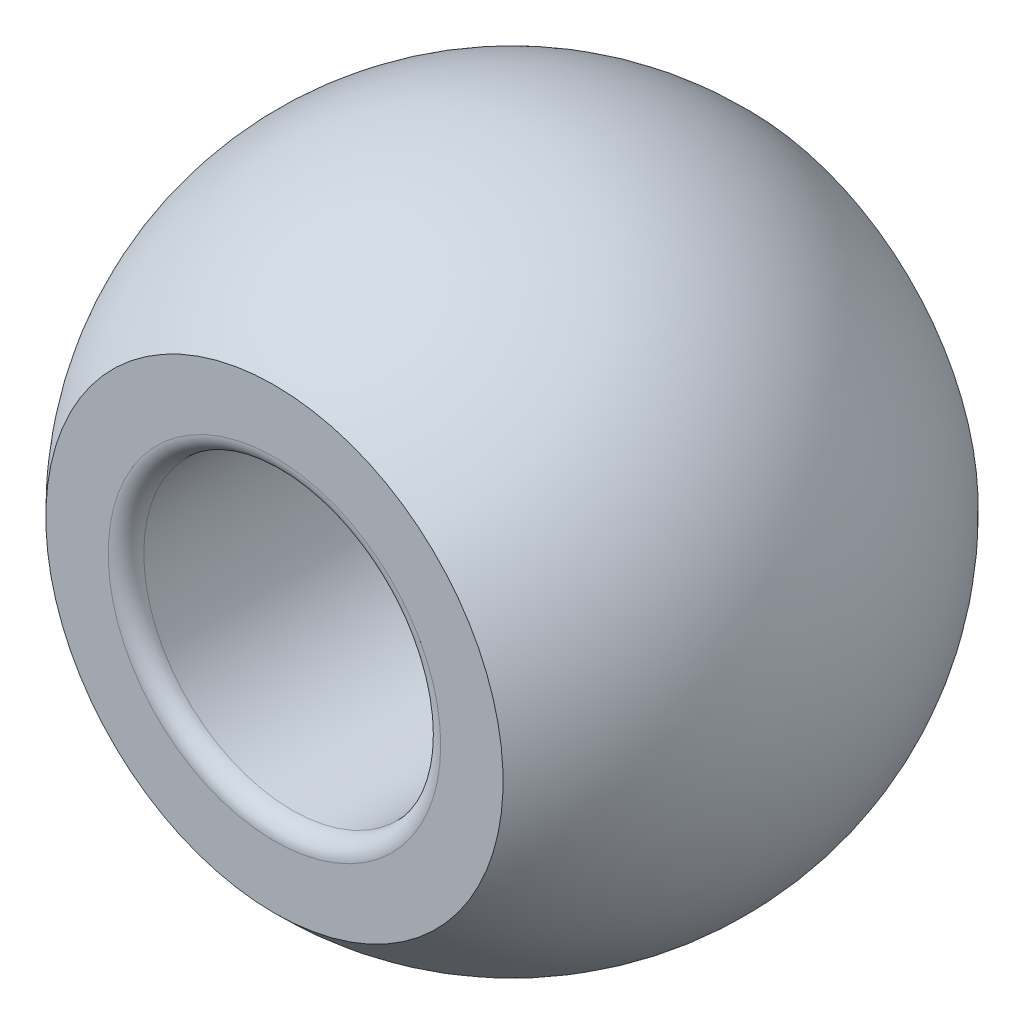
ISO-10303-21;
HEADER;
FILE_DESCRIPTION(('STEP AP214'),'2;1');
FILE_NAME('part.step','',(''),(''),'','','');
FILE_SCHEMA(('AUTOMOTIVE_DESIGN { 1 0 10303 214 1 1 1 1 }'));
ENDSEC;
DATA;
#1=APPLICATION_CONTEXT('core data for automotive mechanical design processes');
#2=APPLICATION_PROTOCOL_DEFINITION('international standard','automotive_design',2000,#1);
#3=PRODUCT_CONTEXT('',#1,'mechanical');
#4=PRODUCT('Part','Part','',(#3));
#5=PRODUCT_RELATED_PRODUCT_CATEGORY('part','',(#4));
#6=PRODUCT_DEFINITION_FORMATION('','',#4);
#7=PRODUCT_DEFINITION_CONTEXT('part definition',#1,'design');
#8=PRODUCT_DEFINITION('design','',#6,#7);
#9=PRODUCT_DEFINITION_SHAPE('','',#8);
#10=(LENGTH_UNIT() NAMED_UNIT(*) SI_UNIT(.MILLI.,.METRE.));
#11=(NAMED_UNIT(*) PLANE_ANGLE_UNIT() SI_UNIT($,.RADIAN.));
#12=(NAMED_UNIT(*) SI_UNIT($,.STERADIAN.) SOLID_ANGLE_UNIT());
#13=UNCERTAINTY_MEASURE_WITH_UNIT(LENGTH_MEASURE(1.E-05),#10,'distance_accuracy_value','');
#14=(GEOMETRIC_REPRESENTATION_CONTEXT(3) GLOBAL_UNCERTAINTY_ASSIGNED_CONTEXT((#13)) GLOBAL_UNIT_ASSIGNED_CONTEXT((#10,
#11,#12)) REPRESENTATION_CONTEXT('',''));
#15=CARTESIAN_POINT('',(0.,0.,0.));
#16=DIRECTION('',(0.,0.,1.));
#17=DIRECTION('',(1.,0.,0.));
#18=AXIS2_PLACEMENT_3D('',#15,#16,#17);
#19=CARTESIAN_POINT('',(-3.84999999999998,-3.84999999999996,4.));
#20=DIRECTION('',(0.,0.,1.));
#21=DIRECTION('',(1.,0.,0.));
#22=AXIS2_PLACEMENT_3D('',#19,#20,#21);
#23=PLANE('',#22);
#24=CARTESIAN_POINT('',(0.,1.196959198424E-13,4.));
#25=DIRECTION('',(0.,0.,1.));
#26=DIRECTION('',(0.,1.,0.));
#27=AXIS2_PLACEMENT_3D('',#24,#25,#26);
#28=CIRCLE('',#27,3.84999999999988);
#29=CARTESIAN_POINT('',(0.,-3.84999999999976,4.));
#30=VERTEX_POINT('',#29);
#31=EDGE_CURVE('E38',#30,#30,#28,.F.);
#32=ORIENTED_EDGE('',*,*,#31,.F.);
#33=EDGE_LOOP('',(#32));
#34=FACE_BOUND('',#33,.T.);
#35=CARTESIAN_POINT('',(0.,0.,4.));
#36=DIRECTION('',(0.,0.,-1.));
#37=DIRECTION('',(1.,0.,0.));
#38=AXIS2_PLACEMENT_3D('',#35,#36,#37);
#39=CIRCLE('',#38,2.80000003462704);
#40=CARTESIAN_POINT('',(2.80000003462704,0.,4.));
#41=VERTEX_POINT('',#40);
#42=EDGE_CURVE('E35',#41,#41,#39,.T.);
#43=ORIENTED_EDGE('',*,*,#42,.T.);
#44=EDGE_LOOP('',(#43));
#45=FACE_BOUND('',#44,.T.);
#46=ADVANCED_FACE('F15',(#34,#45),#23,.T.);
#47=CARTESIAN_POINT('',(3.85,-3.84999999999996,-4.));
#48=DIRECTION('',(0.,0.,-1.));
#49=DIRECTION('',(-1.,0.,0.));
#50=AXIS2_PLACEMENT_3D('',#47,#48,#49);
#51=PLANE('',#50);
#52=CARTESIAN_POINT('',(0.,1.196959198424E-13,-4.));
#53=DIRECTION('',(0.,0.,-1.));
#54=DIRECTION('',(-1.,0.,0.));
#55=AXIS2_PLACEMENT_3D('',#52,#53,#54);
#56=CIRCLE('',#55,3.84999999999988);
#57=CARTESIAN_POINT('',(0.,-3.84999999999976,-4.));
#58=VERTEX_POINT('',#57);
#59=EDGE_CURVE('E30',#58,#58,#56,.T.);
#60=ORIENTED_EDGE('',*,*,#59,.T.);
#61=EDGE_LOOP('',(#60));
#62=FACE_BOUND('',#61,.T.);
#63=CARTESIAN_POINT('',(0.,0.,-4.));
#64=DIRECTION('',(0.,0.,1.));
#65=DIRECTION('',(-1.,0.,0.));
#66=AXIS2_PLACEMENT_3D('',#63,#64,#65);
#67=CIRCLE('',#66,2.80000003462704);
#68=CARTESIAN_POINT('',(-2.80000003462704,0.,-4.));
#69=VERTEX_POINT('',#68);
#70=EDGE_CURVE('E26',#69,#69,#67,.F.);
#71=ORIENTED_EDGE('',*,*,#70,.F.);
#72=EDGE_LOOP('',(#71));
#73=FACE_BOUND('',#72,.T.);
#74=ADVANCED_FACE('F47',(#62,#73),#51,.T.);
#75=CARTESIAN_POINT('',(0.,1.196959198424E-13,0.));
#76=DIRECTION('',(0.,0.,-1.));
#77=DIRECTION('',(0.,-1.,0.));
#78=AXIS2_PLACEMENT_3D('',#75,#76,#77);
#79=SPHERICAL_SURFACE('',#78,5.55180150942008);
#80=CARTESIAN_POINT('',(0.,-3.84999999999976,4.));
#81=CARTESIAN_POINT('',(0.,-3.91704355546375,3.93547352212628));
#82=CARTESIAN_POINT('',(0.,-3.9824618070378,3.86925868346542));
#83=CARTESIAN_POINT('',(0.,-4.10988914115137,3.73362604085695));
#84=CARTESIAN_POINT('',(0.,-4.17189822369089,3.66420823690934));
#85=CARTESIAN_POINT('',(0.,-4.29234865848073,3.52234342001489));
#86=CARTESIAN_POINT('',(0.,-4.35079001073106,3.44989640706805));
#87=CARTESIAN_POINT('',(0.,-4.46395775084166,3.30215675473695));
#88=CARTESIAN_POINT('',(0.,-4.51868413870194,3.22686411535269));
#89=CARTESIAN_POINT('',(0.,-4.62428348753957,3.07362340431527));
#90=CARTESIAN_POINT('',(0.,-4.67515644851693,2.99567533266211));
#91=CARTESIAN_POINT('',(0.,-4.77292038717241,2.83732081913693));
#92=CARTESIAN_POINT('',(0.,-4.81981136485053,2.75691437726492));
#93=CARTESIAN_POINT('',(0.,-4.90949280131945,2.59384635763429));
#94=CARTESIAN_POINT('',(0.,-4.95228326011024,2.51118477987568));
#95=CARTESIAN_POINT('',(0.,-5.03365549998964,2.34381543428769));
#96=CARTESIAN_POINT('',(0.,-5.07223728107824,2.25910766645832));
#97=CARTESIAN_POINT('',(0.,-5.14509464181271,2.08786005569754));
#98=CARTESIAN_POINT('',(0.,-5.17937022145858,2.00132021276613));
#99=CARTESIAN_POINT('',(0.,-5.24352854119565,1.82662719850433));
#100=CARTESIAN_POINT('',(0.,-5.27341128128685,1.73847402717393));
#101=CARTESIAN_POINT('',(0.,-5.32870838734267,1.56077718060797));
#102=CARTESIAN_POINT('',(0.,-5.35412275330729,1.47123350537242));
#103=CARTESIAN_POINT('',(0.,-5.4004188712969,1.29098199032071));
#104=CARTESIAN_POINT('',(0.,-5.42130062332189,1.20027415050457));
#105=CARTESIAN_POINT('',(0.,-5.45847873067911,1.01792358825653));
#106=CARTESIAN_POINT('',(0.,-5.47477508601133,0.926280865824649));
#107=CARTESIAN_POINT('',(0.,-5.50274120772943,0.742292183414471));
#108=CARTESIAN_POINT('',(0.,-5.51441097411531,0.649946223436177));
#109=CARTESIAN_POINT('',(0.,-5.53309442030267,0.464784488573093));
#110=CARTESIAN_POINT('',(0.,-5.54010810010415,0.371968713688304));
#111=CARTESIAN_POINT('',(0.,-5.5494616446628,0.186101959202343));
#112=CARTESIAN_POINT('',(0.,-5.55180150941996,0.0930509796011709));
#113=CARTESIAN_POINT('',(0.,-5.55180150941996,-0.0930509796011725));
#114=CARTESIAN_POINT('',(0.,-5.5494616446628,-0.186101959202344));
#115=CARTESIAN_POINT('',(0.,-5.54010810010415,-0.371968713688305));
#116=CARTESIAN_POINT('',(0.,-5.53309442030267,-0.464784488573095));
#117=CARTESIAN_POINT('',(0.,-5.51441097411531,-0.649946223436178));
#118=CARTESIAN_POINT('',(0.,-5.50274120772943,-0.742292183414472));
#119=CARTESIAN_POINT('',(0.,-5.47477508601133,-0.926280865824651));
#120=CARTESIAN_POINT('',(0.,-5.45847873067911,-1.01792358825653));
#121=CARTESIAN_POINT('',(0.,-5.42130062332189,-1.20027415050457));
#122=CARTESIAN_POINT('',(0.,-5.40041887129689,-1.29098199032072));
#123=CARTESIAN_POINT('',(0.,-5.35412275330729,-1.47123350537242));
#124=CARTESIAN_POINT('',(0.,-5.32870838734267,-1.56077718060797));
#125=CARTESIAN_POINT('',(0.,-5.27341128128685,-1.73847402717393));
#126=CARTESIAN_POINT('',(0.,-5.24352854119565,-1.82662719850433));
#127=CARTESIAN_POINT('',(0.,-5.17937022145858,-2.00132021276614));
#128=CARTESIAN_POINT('',(0.,-5.14509464181271,-2.08786005569754));
#129=CARTESIAN_POINT('',(0.,-5.07223728107824,-2.25910766645832));
#130=CARTESIAN_POINT('',(0.,-5.03365549998964,-2.3438154342877));
#131=CARTESIAN_POINT('',(0.,-4.95228326011024,-2.51118477987568));
#132=CARTESIAN_POINT('',(0.,-4.90949280131945,-2.59384635763429));
#133=CARTESIAN_POINT('',(0.,-4.81981136485053,-2.75691437726492));
#134=CARTESIAN_POINT('',(0.,-4.77292038717241,-2.83732081913693));
#135=CARTESIAN_POINT('',(0.,-4.67515644851693,-2.99567533266211));
#136=CARTESIAN_POINT('',(0.,-4.62428348753957,-3.07362340431527));
#137=CARTESIAN_POINT('',(0.,-4.51868413870194,-3.22686411535269));
#138=CARTESIAN_POINT('',(0.,-4.46395775084166,-3.30215675473695));
#139=CARTESIAN_POINT('',(0.,-4.35079001073106,-3.44989640706805));
#140=CARTESIAN_POINT('',(0.,-4.29234865848073,-3.52234342001489));
#141=CARTESIAN_POINT('',(0.,-4.17189822369089,-3.66420823690934));
#142=CARTESIAN_POINT('',(0.,-4.10988914115137,-3.73362604085695));
#143=CARTESIAN_POINT('',(0.,-3.9824618070378,-3.86925868346542));
#144=CARTESIAN_POINT('',(0.,-3.91704355546375,-3.93547352212628));
#145=CARTESIAN_POINT('',(0.,-3.84999999999976,-4.));
#146=B_SPLINE_CURVE_WITH_KNOTS('',3,(#80,#81,#82,#83,#84,#85,#86,#87,#88,#89,#90,#91,#92,#93,
#94,#95,#96,#97,#98,#99,#100,#101,#102,#103,#104,#105,#106,#107,#108,#109,#110,#111,#112,#113,
#114,#115,#116,#117,#118,#119,#120,#121,#122,#123,#124,#125,#126,#127,#128,#129,#130,#131,#132,
#133,#134,#135,#136,#137,#138,#139,#140,#141,#142,#143,#144,#145),.UNSPECIFIED.,.F.,.F.,(4,2,2,
2,2,2,2,2,2,2,2,2,2,2,2,2,2,2,2,2,2,2,2,2,2,2,2,2,2,2,2,2,4),(0.,0.279123542863115,
0.558247085726229,0.837370628589344,1.11649417145246,1.39561771431557,1.67474125717869,
1.9538648000418,2.23298834290492,2.51211188576803,2.79123542863115,3.07035897149426,
3.34948251435738,3.62860605722049,3.9077296000836,4.18685314294672,4.46597668580983,
4.74510022867295,5.02422377153606,5.30334731439918,5.58247085726229,5.86159440012541,
6.14071794298852,6.41984148585164,6.69896502871475,6.97808857157787,7.25721211444098,
7.5363356573041,7.81545920016721,8.09458274303033,8.37370628589344,8.65282982875655,
8.93195337161967),.UNSPECIFIED.);
#147=EDGE_CURVE('BSEAM42',#30,#58,#146,.T.);
#148=ORIENTED_EDGE('',*,*,#31,.T.);
#149=ORIENTED_EDGE('',*,*,#59,.F.);
#150=ORIENTED_EDGE('',*,*,#147,.T.);
#151=ORIENTED_EDGE('',*,*,#147,.F.);
#152=EDGE_LOOP('',(#148,#150,#149,#151));
#153=FACE_BOUND('',#152,.T.);
#154=ADVANCED_FACE('F42',(#153),#79,.T.);
#155=CARTESIAN_POINT('',(0.,0.,3.70000000000012));
#156=DIRECTION('',(0.,0.,-1.));
#157=DIRECTION('',(1.,0.,0.));
#158=AXIS2_PLACEMENT_3D('',#155,#156,#157);
#159=TOROIDAL_SURFACE('',#158,2.79999999999988,0.299999999999877);
#160=CARTESIAN_POINT('',(0.,0.,3.7));
#161=DIRECTION('',(0.,0.,-1.));
#162=DIRECTION('',(1.,0.,0.));
#163=AXIS2_PLACEMENT_3D('',#160,#161,#162);
#164=CIRCLE('',#163,2.5);
#165=CARTESIAN_POINT('',(2.5,0.,3.7));
#166=VERTEX_POINT('',#165);
#167=EDGE_CURVE('E22',#166,#166,#164,.T.);
#168=ORIENTED_EDGE('',*,*,#167,.T.);
#169=EDGE_LOOP('',(#168));
#170=FACE_BOUND('',#169,.T.);
#171=ORIENTED_EDGE('',*,*,#42,.F.);
#172=EDGE_LOOP('',(#171));
#173=FACE_BOUND('',#172,.T.);
#174=ADVANCED_FACE('F51',(#170,#173),#159,.T.);
#175=CARTESIAN_POINT('',(0.,0.,-50.));
#176=DIRECTION('',(0.,0.,-1.));
#177=DIRECTION('',(1.,0.,0.));
#178=AXIS2_PLACEMENT_3D('',#175,#176,#177);
#179=CYLINDRICAL_SURFACE('',#178,2.5);
#180=CARTESIAN_POINT('',(0.,0.,-3.7));
#181=DIRECTION('',(0.,0.,-1.));
#182=DIRECTION('',(1.,0.,0.));
#183=AXIS2_PLACEMENT_3D('',#180,#181,#182);
#184=CIRCLE('',#183,2.5);
#185=CARTESIAN_POINT('',(2.5,0.,-3.7));
#186=VERTEX_POINT('',#185);
#187=EDGE_CURVE('E10',#186,#186,#184,.T.);
#188=ORIENTED_EDGE('',*,*,#187,.T.);
#189=EDGE_LOOP('',(#188));
#190=FACE_BOUND('',#189,.T.);
#191=ORIENTED_EDGE('',*,*,#167,.F.);
#192=EDGE_LOOP('',(#191));
#193=FACE_BOUND('',#192,.T.);
#194=ADVANCED_FACE('F53',(#190,#193),#179,.F.);
#195=CARTESIAN_POINT('',(0.,0.,-3.70000000000012));
#196=DIRECTION('',(0.,0.,-1.));
#197=DIRECTION('',(1.,7.6930563065056E-10,0.));
#198=AXIS2_PLACEMENT_3D('',#195,#196,#197);
#199=TOROIDAL_SURFACE('',#198,2.79999999999988,0.299999999999877);
#200=ORIENTED_EDGE('',*,*,#70,.T.);
#201=EDGE_LOOP('',(#200));
#202=FACE_BOUND('',#201,.T.);
#203=ORIENTED_EDGE('',*,*,#187,.F.);
#204=EDGE_LOOP('',(#203));
#205=FACE_BOUND('',#204,.T.);
#206=ADVANCED_FACE('F17',(#202,#205),#199,.T.);
#207=CLOSED_SHELL('',(#46,#74,#154,#174,#194,#206));
#208=MANIFOLD_SOLID_BREP('B1',#207);
#209=ADVANCED_BREP_SHAPE_REPRESENTATION('',(#18,#208),#14);
#210=SHAPE_DEFINITION_REPRESENTATION(#9,#209);
ENDSEC;
END-ISO-10303-21;
